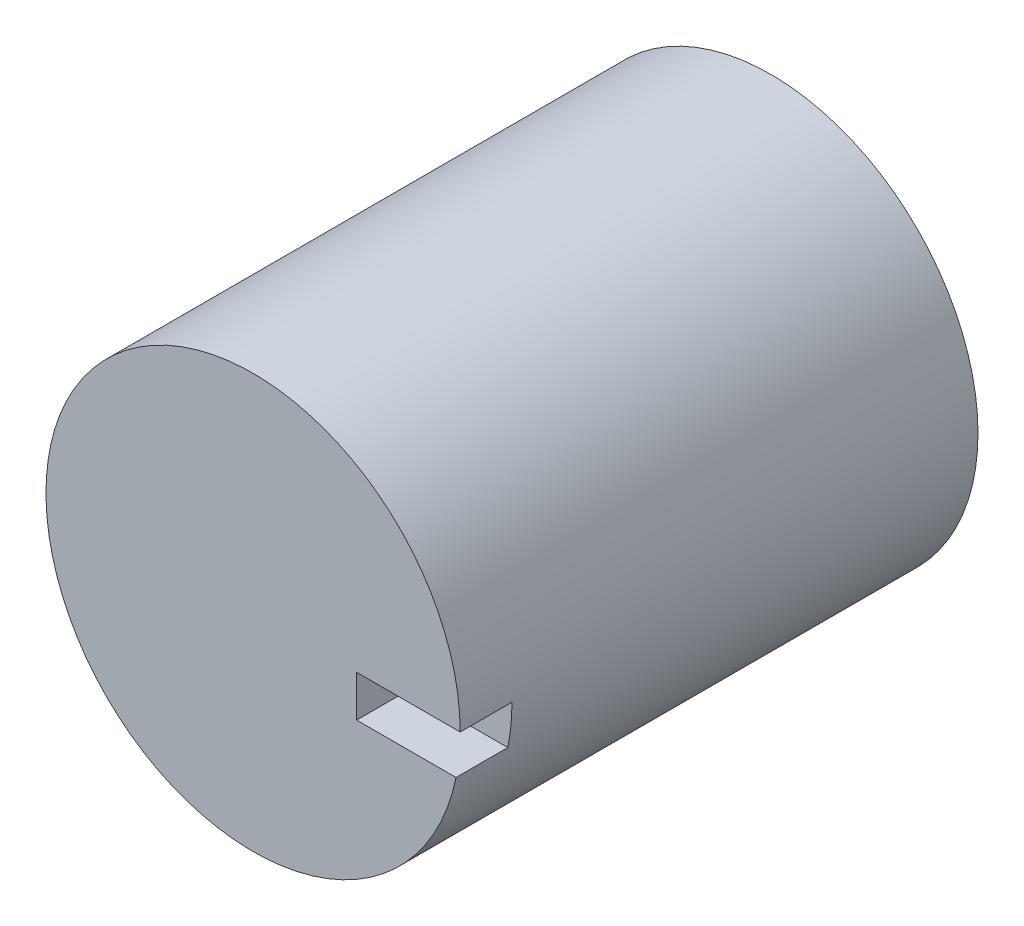
ISO-10303-21;
HEADER;
FILE_DESCRIPTION(('STEP AP214'),'2;1');
FILE_NAME('part.step','',(''),(''),'','','');
FILE_SCHEMA(('AUTOMOTIVE_DESIGN { 1 0 10303 214 1 1 1 1 }'));
ENDSEC;
DATA;
#1=APPLICATION_CONTEXT('core data for automotive mechanical design processes');
#2=APPLICATION_PROTOCOL_DEFINITION('international standard','automotive_design',2000,#1);
#3=PRODUCT_CONTEXT('',#1,'mechanical');
#4=PRODUCT('Part','Part','',(#3));
#5=PRODUCT_RELATED_PRODUCT_CATEGORY('part','',(#4));
#6=PRODUCT_DEFINITION_FORMATION('','',#4);
#7=PRODUCT_DEFINITION_CONTEXT('part definition',#1,'design');
#8=PRODUCT_DEFINITION('design','',#6,#7);
#9=PRODUCT_DEFINITION_SHAPE('','',#8);
#10=(LENGTH_UNIT() NAMED_UNIT(*) SI_UNIT(.MILLI.,.METRE.));
#11=(NAMED_UNIT(*) PLANE_ANGLE_UNIT() SI_UNIT($,.RADIAN.));
#12=(NAMED_UNIT(*) SI_UNIT($,.STERADIAN.) SOLID_ANGLE_UNIT());
#13=UNCERTAINTY_MEASURE_WITH_UNIT(LENGTH_MEASURE(1.E-05),#10,'distance_accuracy_value','');
#14=(GEOMETRIC_REPRESENTATION_CONTEXT(3) GLOBAL_UNCERTAINTY_ASSIGNED_CONTEXT((#13)) GLOBAL_UNIT_ASSIGNED_CONTEXT((#10,
#11,#12)) REPRESENTATION_CONTEXT('',''));
#15=CARTESIAN_POINT('',(0.,0.,0.));
#16=DIRECTION('',(0.,0.,1.));
#17=DIRECTION('',(1.,0.,0.));
#18=AXIS2_PLACEMENT_3D('',#15,#16,#17);
#19=CARTESIAN_POINT('',(0.,0.,-50.));
#20=DIRECTION('',(0.,0.,1.));
#21=DIRECTION('',(1.,0.,0.));
#22=AXIS2_PLACEMENT_3D('',#19,#20,#21);
#23=CYLINDRICAL_SURFACE('',#22,20.);
#24=DIRECTION('',(0.,0.,1.));
#25=VECTOR('',#24,1.);
#26=CARTESIAN_POINT('',(19.5959179422654,-4.,-50.));
#27=LINE('',#26,#25);
#28=CARTESIAN_POINT('',(19.5959179422654,-4.,0.));
#29=VERTEX_POINT('',#28);
#30=CARTESIAN_POINT('',(19.5959179422654,-4.,-5.));
#31=VERTEX_POINT('',#30);
#32=EDGE_CURVE('E82',#29,#31,#27,.F.);
#33=ORIENTED_EDGE('',*,*,#32,.F.);
#34=CARTESIAN_POINT('',(0.,0.,0.));
#35=DIRECTION('',(0.,0.,1.));
#36=DIRECTION('',(1.,0.,0.));
#37=AXIS2_PLACEMENT_3D('',#34,#35,#36);
#38=CIRCLE('',#37,20.);
#39=CARTESIAN_POINT('',(20.,0.,0.));
#40=VERTEX_POINT('',#39);
#41=EDGE_CURVE('E102',#40,#29,#38,.T.);
#42=ORIENTED_EDGE('',*,*,#41,.F.);
#43=DIRECTION('',(0.,0.,1.));
#44=VECTOR('',#43,1.);
#45=CARTESIAN_POINT('',(20.,0.,-50.));
#46=LINE('',#45,#44);
#47=CARTESIAN_POINT('',(20.,0.,-5.));
#48=VERTEX_POINT('',#47);
#49=EDGE_CURVE('E52',#40,#48,#46,.F.);
#50=ORIENTED_EDGE('',*,*,#49,.T.);
#51=CARTESIAN_POINT('',(0.,0.,-5.));
#52=DIRECTION('',(0.,0.,-1.));
#53=DIRECTION('',(-1.,0.,0.));
#54=AXIS2_PLACEMENT_3D('',#51,#52,#53);
#55=CIRCLE('',#54,20.);
#56=EDGE_CURVE('E11',#31,#48,#55,.F.);
#57=ORIENTED_EDGE('',*,*,#56,.F.);
#58=EDGE_LOOP('',(#33,#42,#50,#57));
#59=FACE_BOUND('',#58,.T.);
#60=CARTESIAN_POINT('',(0.,0.,-50.));
#61=DIRECTION('',(0.,0.,1.));
#62=DIRECTION('',(1.,0.,0.));
#63=AXIS2_PLACEMENT_3D('',#60,#61,#62);
#64=CIRCLE('',#63,20.);
#65=CARTESIAN_POINT('',(20.,0.,-50.));
#66=VERTEX_POINT('',#65);
#67=EDGE_CURVE('E104',#66,#66,#64,.T.);
#68=ORIENTED_EDGE('',*,*,#67,.T.);
#69=EDGE_LOOP('',(#68));
#70=FACE_BOUND('',#69,.T.);
#71=ADVANCED_FACE('F39',(#59,#70),#23,.T.);
#72=CARTESIAN_POINT('',(0.,0.,-50.));
#73=DIRECTION('',(0.,0.,1.));
#74=DIRECTION('',(1.,0.,0.));
#75=AXIS2_PLACEMENT_3D('',#72,#73,#74);
#76=PLANE('',#75);
#77=ORIENTED_EDGE('',*,*,#67,.F.);
#78=EDGE_LOOP('',(#77));
#79=FACE_BOUND('',#78,.T.);
#80=ADVANCED_FACE('F127',(#79),#76,.F.);
#81=CARTESIAN_POINT('',(0.,0.,0.));
#82=DIRECTION('',(0.,0.,1.));
#83=DIRECTION('',(1.,0.,0.));
#84=AXIS2_PLACEMENT_3D('',#81,#82,#83);
#85=PLANE('',#84);
#86=DIRECTION('',(1.,0.,0.));
#87=VECTOR('',#86,1.);
#88=CARTESIAN_POINT('',(0.,-4.,0.));
#89=LINE('',#88,#87);
#90=CARTESIAN_POINT('',(10.,-4.,0.));
#91=VERTEX_POINT('',#90);
#92=EDGE_CURVE('E46',#91,#29,#89,.T.);
#93=ORIENTED_EDGE('',*,*,#92,.F.);
#94=DIRECTION('',(0.,-1.,0.));
#95=VECTOR('',#94,1.);
#96=CARTESIAN_POINT('',(10.,0.,0.));
#97=LINE('',#96,#95);
#98=CARTESIAN_POINT('',(10.,0.,0.));
#99=VERTEX_POINT('',#98);
#100=EDGE_CURVE('E96',#99,#91,#97,.T.);
#101=ORIENTED_EDGE('',*,*,#100,.F.);
#102=DIRECTION('',(1.,0.,0.));
#103=VECTOR('',#102,1.);
#104=CARTESIAN_POINT('',(0.,0.,0.));
#105=LINE('',#104,#103);
#106=EDGE_CURVE('E107',#99,#40,#105,.T.);
#107=ORIENTED_EDGE('',*,*,#106,.T.);
#108=ORIENTED_EDGE('',*,*,#41,.T.);
#109=EDGE_LOOP('',(#93,#101,#107,#108));
#110=FACE_BOUND('',#109,.T.);
#111=ADVANCED_FACE('F111',(#110),#85,.T.);
#112=CARTESIAN_POINT('',(10.,-4.,5.));
#113=DIRECTION('',(-1.,0.,0.));
#114=DIRECTION('',(0.,0.,1.));
#115=AXIS2_PLACEMENT_3D('',#112,#113,#114);
#116=PLANE('',#115);
#117=ORIENTED_EDGE('',*,*,#100,.T.);
#118=DIRECTION('',(0.,0.,1.));
#119=VECTOR('',#118,1.);
#120=CARTESIAN_POINT('',(10.,-4.,5.));
#121=LINE('',#120,#119);
#122=CARTESIAN_POINT('',(10.,-4.,-5.));
#123=VERTEX_POINT('',#122);
#124=EDGE_CURVE('E81',#123,#91,#121,.T.);
#125=ORIENTED_EDGE('',*,*,#124,.F.);
#126=DIRECTION('',(0.,1.,0.));
#127=VECTOR('',#126,1.);
#128=CARTESIAN_POINT('',(10.,-4.,-5.));
#129=LINE('',#128,#127);
#130=CARTESIAN_POINT('',(10.,0.,-5.));
#131=VERTEX_POINT('',#130);
#132=EDGE_CURVE('E85',#123,#131,#129,.T.);
#133=ORIENTED_EDGE('',*,*,#132,.T.);
#134=DIRECTION('',(0.,0.,1.));
#135=VECTOR('',#134,1.);
#136=CARTESIAN_POINT('',(10.,0.,5.));
#137=LINE('',#136,#135);
#138=EDGE_CURVE('E98',#131,#99,#137,.T.);
#139=ORIENTED_EDGE('',*,*,#138,.T.);
#140=EDGE_LOOP('',(#117,#125,#133,#139));
#141=FACE_BOUND('',#140,.T.);
#142=ADVANCED_FACE('F94',(#141),#116,.F.);
#143=CARTESIAN_POINT('',(10.,-4.,-5.));
#144=DIRECTION('',(0.,0.,-1.));
#145=DIRECTION('',(-1.,0.,0.));
#146=AXIS2_PLACEMENT_3D('',#143,#144,#145);
#147=PLANE('',#146);
#148=ORIENTED_EDGE('',*,*,#56,.T.);
#149=DIRECTION('',(-1.,0.,0.));
#150=VECTOR('',#149,1.);
#151=CARTESIAN_POINT('',(10.,0.,-5.));
#152=LINE('',#151,#150);
#153=EDGE_CURVE('E90',#48,#131,#152,.T.);
#154=ORIENTED_EDGE('',*,*,#153,.T.);
#155=ORIENTED_EDGE('',*,*,#132,.F.);
#156=DIRECTION('',(-1.,0.,0.));
#157=VECTOR('',#156,1.);
#158=CARTESIAN_POINT('',(10.,-4.,-5.));
#159=LINE('',#158,#157);
#160=EDGE_CURVE('E79',#31,#123,#159,.T.);
#161=ORIENTED_EDGE('',*,*,#160,.F.);
#162=EDGE_LOOP('',(#148,#154,#155,#161));
#163=FACE_BOUND('',#162,.T.);
#164=ADVANCED_FACE('F86',(#163),#147,.F.);
#165=CARTESIAN_POINT('',(0.,-4.,0.));
#166=DIRECTION('',(0.,-1.,0.));
#167=DIRECTION('',(0.,0.,-1.));
#168=AXIS2_PLACEMENT_3D('',#165,#166,#167);
#169=PLANE('',#168);
#170=ORIENTED_EDGE('',*,*,#32,.T.);
#171=ORIENTED_EDGE('',*,*,#160,.T.);
#172=ORIENTED_EDGE('',*,*,#124,.T.);
#173=ORIENTED_EDGE('',*,*,#92,.T.);
#174=EDGE_LOOP('',(#170,#171,#172,#173));
#175=FACE_BOUND('',#174,.T.);
#176=ADVANCED_FACE('F80',(#175),#169,.F.);
#177=CARTESIAN_POINT('',(0.,0.,0.));
#178=DIRECTION('',(0.,-1.,0.));
#179=DIRECTION('',(0.,0.,-1.));
#180=AXIS2_PLACEMENT_3D('',#177,#178,#179);
#181=PLANE('',#180);
#182=ORIENTED_EDGE('',*,*,#106,.F.);
#183=ORIENTED_EDGE('',*,*,#138,.F.);
#184=ORIENTED_EDGE('',*,*,#153,.F.);
#185=ORIENTED_EDGE('',*,*,#49,.F.);
#186=EDGE_LOOP('',(#182,#183,#184,#185));
#187=FACE_BOUND('',#186,.T.);
#188=ADVANCED_FACE('F119',(#187),#181,.T.);
#189=CLOSED_SHELL('',(#71,#80,#111,#142,#164,#176,#188));
#190=MANIFOLD_SOLID_BREP('B2',#189);
#191=ADVANCED_BREP_SHAPE_REPRESENTATION('',(#18,#190),#14);
#192=SHAPE_DEFINITION_REPRESENTATION(#9,#191);
ENDSEC;
END-ISO-10303-21;
